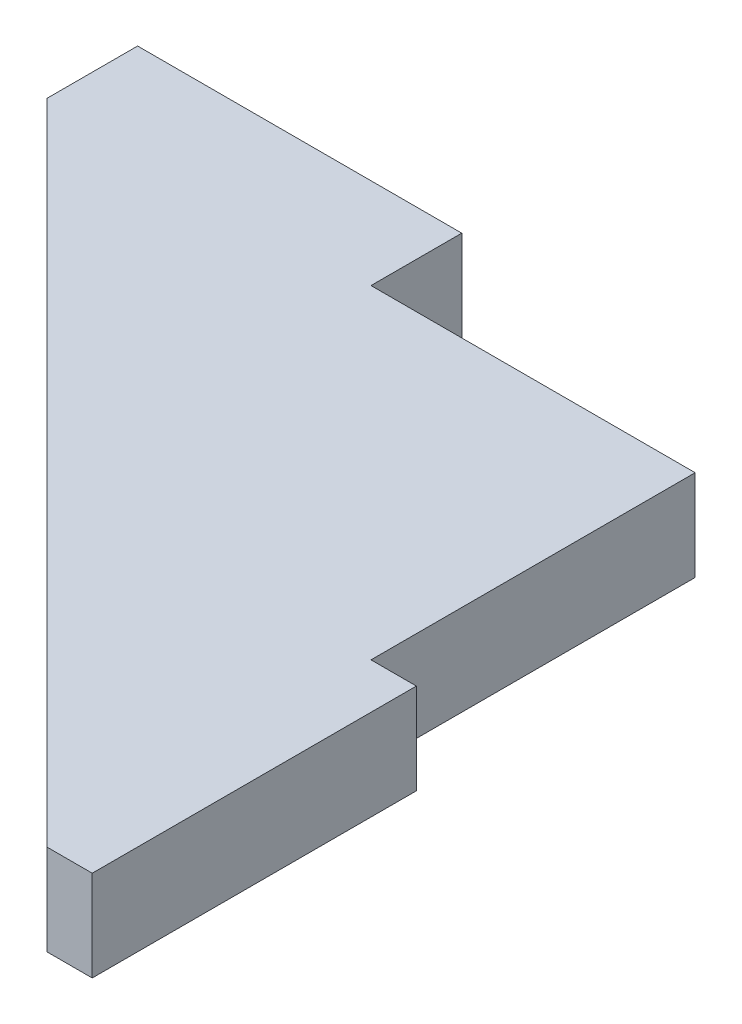
ISO-10303-21;
HEADER;
FILE_DESCRIPTION(('STEP AP214'),'2;1');
FILE_NAME('part.step','',(''),(''),'','','');
FILE_SCHEMA(('AUTOMOTIVE_DESIGN { 1 0 10303 214 1 1 1 1 }'));
ENDSEC;
DATA;
#1=APPLICATION_CONTEXT('core data for automotive mechanical design processes');
#2=APPLICATION_PROTOCOL_DEFINITION('international standard','automotive_design',2000,#1);
#3=PRODUCT_CONTEXT('',#1,'mechanical');
#4=PRODUCT('Part','Part','',(#3));
#5=PRODUCT_RELATED_PRODUCT_CATEGORY('part','',(#4));
#6=PRODUCT_DEFINITION_FORMATION('','',#4);
#7=PRODUCT_DEFINITION_CONTEXT('part definition',#1,'design');
#8=PRODUCT_DEFINITION('design','',#6,#7);
#9=PRODUCT_DEFINITION_SHAPE('','',#8);
#10=(LENGTH_UNIT() NAMED_UNIT(*) SI_UNIT(.MILLI.,.METRE.));
#11=(NAMED_UNIT(*) PLANE_ANGLE_UNIT() SI_UNIT($,.RADIAN.));
#12=(NAMED_UNIT(*) SI_UNIT($,.STERADIAN.) SOLID_ANGLE_UNIT());
#13=UNCERTAINTY_MEASURE_WITH_UNIT(LENGTH_MEASURE(1.E-05),#10,'distance_accuracy_value','');
#14=(GEOMETRIC_REPRESENTATION_CONTEXT(3) GLOBAL_UNCERTAINTY_ASSIGNED_CONTEXT((#13)) GLOBAL_UNIT_ASSIGNED_CONTEXT((#10,
#11,#12)) REPRESENTATION_CONTEXT('',''));
#15=CARTESIAN_POINT('',(0.,0.,0.));
#16=DIRECTION('',(0.,0.,1.));
#17=DIRECTION('',(1.,0.,0.));
#18=AXIS2_PLACEMENT_3D('',#15,#16,#17);
#19=CARTESIAN_POINT('',(116.6,5.6,25.6));
#20=DIRECTION('',(1.,0.,0.));
#21=DIRECTION('',(0.,0.,-1.));
#22=AXIS2_PLACEMENT_3D('',#19,#20,#21);
#23=PLANE('',#22);
#24=DIRECTION('',(0.,0.,1.));
#25=VECTOR('',#24,1.);
#26=CARTESIAN_POINT('',(116.6,0.,25.6));
#27=LINE('',#26,#25);
#28=CARTESIAN_POINT('',(116.6,0.,5.59999999999998));
#29=VERTEX_POINT('',#28);
#30=CARTESIAN_POINT('',(116.6,0.,25.6));
#31=VERTEX_POINT('',#30);
#32=EDGE_CURVE('E135',#29,#31,#27,.T.);
#33=ORIENTED_EDGE('',*,*,#32,.F.);
#34=DIRECTION('',(0.,-1.,0.));
#35=VECTOR('',#34,1.);
#36=CARTESIAN_POINT('',(116.6,5.6,5.59999999999998));
#37=LINE('',#36,#35);
#38=CARTESIAN_POINT('',(116.6,5.6,5.59999999999998));
#39=VERTEX_POINT('',#38);
#40=EDGE_CURVE('E11',#39,#29,#37,.T.);
#41=ORIENTED_EDGE('',*,*,#40,.F.);
#42=DIRECTION('',(0.,0.,1.));
#43=VECTOR('',#42,1.);
#44=CARTESIAN_POINT('',(116.6,5.6,25.6));
#45=LINE('',#44,#43);
#46=CARTESIAN_POINT('',(116.6,5.6,25.6));
#47=VERTEX_POINT('',#46);
#48=EDGE_CURVE('E158',#39,#47,#45,.T.);
#49=ORIENTED_EDGE('',*,*,#48,.T.);
#50=DIRECTION('',(0.,-1.,0.));
#51=VECTOR('',#50,1.);
#52=CARTESIAN_POINT('',(116.6,5.6,25.6));
#53=LINE('',#52,#51);
#54=EDGE_CURVE('E35',#47,#31,#53,.T.);
#55=ORIENTED_EDGE('',*,*,#54,.T.);
#56=EDGE_LOOP('',(#33,#41,#49,#55));
#57=FACE_BOUND('',#56,.T.);
#58=ADVANCED_FACE('F32',(#57),#23,.T.);
#59=CARTESIAN_POINT('',(116.6,5.6,5.59999999999998));
#60=DIRECTION('',(0.,0.,-1.));
#61=DIRECTION('',(-1.,0.,0.));
#62=AXIS2_PLACEMENT_3D('',#59,#60,#61);
#63=PLANE('',#62);
#64=DIRECTION('',(1.,0.,0.));
#65=VECTOR('',#64,1.);
#66=CARTESIAN_POINT('',(116.6,0.,5.59999999999998));
#67=LINE('',#66,#65);
#68=CARTESIAN_POINT('',(96.6000000000001,0.,5.6));
#69=VERTEX_POINT('',#68);
#70=EDGE_CURVE('E156',#69,#29,#67,.T.);
#71=ORIENTED_EDGE('',*,*,#70,.F.);
#72=DIRECTION('',(0.,-1.,0.));
#73=VECTOR('',#72,1.);
#74=CARTESIAN_POINT('',(96.6000000000001,5.6,5.6));
#75=LINE('',#74,#73);
#76=CARTESIAN_POINT('',(96.6000000000001,5.6,5.6));
#77=VERTEX_POINT('',#76);
#78=EDGE_CURVE('E41',#77,#69,#75,.T.);
#79=ORIENTED_EDGE('',*,*,#78,.F.);
#80=DIRECTION('',(1.,0.,0.));
#81=VECTOR('',#80,1.);
#82=CARTESIAN_POINT('',(116.6,5.6,5.59999999999998));
#83=LINE('',#82,#81);
#84=EDGE_CURVE('E125',#77,#39,#83,.T.);
#85=ORIENTED_EDGE('',*,*,#84,.T.);
#86=ORIENTED_EDGE('',*,*,#40,.T.);
#87=EDGE_LOOP('',(#71,#79,#85,#86));
#88=FACE_BOUND('',#87,.T.);
#89=ADVANCED_FACE('F172',(#88),#63,.T.);
#90=CARTESIAN_POINT('',(96.6000000000001,5.6,5.6));
#91=DIRECTION('',(1.,0.,0.));
#92=DIRECTION('',(0.,0.,-1.));
#93=AXIS2_PLACEMENT_3D('',#90,#91,#92);
#94=PLANE('',#93);
#95=DIRECTION('',(0.,0.,1.));
#96=VECTOR('',#95,1.);
#97=CARTESIAN_POINT('',(96.6000000000001,0.,5.6));
#98=LINE('',#97,#96);
#99=CARTESIAN_POINT('',(96.6000000000001,0.,0.));
#100=VERTEX_POINT('',#99);
#101=EDGE_CURVE('E112',#100,#69,#98,.T.);
#102=ORIENTED_EDGE('',*,*,#101,.F.);
#103=DIRECTION('',(0.,-1.,0.));
#104=VECTOR('',#103,1.);
#105=CARTESIAN_POINT('',(96.6000000000001,5.6,0.));
#106=LINE('',#105,#104);
#107=CARTESIAN_POINT('',(96.6000000000001,5.6,0.));
#108=VERTEX_POINT('',#107);
#109=EDGE_CURVE('E107',#108,#100,#106,.T.);
#110=ORIENTED_EDGE('',*,*,#109,.F.);
#111=DIRECTION('',(0.,0.,1.));
#112=VECTOR('',#111,1.);
#113=CARTESIAN_POINT('',(96.6000000000001,5.6,5.6));
#114=LINE('',#113,#112);
#115=EDGE_CURVE('E110',#108,#77,#114,.T.);
#116=ORIENTED_EDGE('',*,*,#115,.T.);
#117=ORIENTED_EDGE('',*,*,#78,.T.);
#118=EDGE_LOOP('',(#102,#110,#116,#117));
#119=FACE_BOUND('',#118,.T.);
#120=ADVANCED_FACE('F109',(#119),#94,.T.);
#121=CARTESIAN_POINT('',(96.6000000000001,5.6,0.));
#122=DIRECTION('',(0.,0.,-1.));
#123=DIRECTION('',(-1.,0.,0.));
#124=AXIS2_PLACEMENT_3D('',#121,#122,#123);
#125=PLANE('',#124);
#126=DIRECTION('',(1.,0.,0.));
#127=VECTOR('',#126,1.);
#128=CARTESIAN_POINT('',(96.6000000000001,0.,0.));
#129=LINE('',#128,#127);
#130=CARTESIAN_POINT('',(76.6000000000001,0.,0.));
#131=VERTEX_POINT('',#130);
#132=EDGE_CURVE('E153',#131,#100,#129,.T.);
#133=ORIENTED_EDGE('',*,*,#132,.F.);
#134=DIRECTION('',(0.,-1.,0.));
#135=VECTOR('',#134,1.);
#136=CARTESIAN_POINT('',(76.6000000000001,5.6,0.));
#137=LINE('',#136,#135);
#138=CARTESIAN_POINT('',(76.6000000000001,5.6,0.));
#139=VERTEX_POINT('',#138);
#140=EDGE_CURVE('E117',#139,#131,#137,.T.);
#141=ORIENTED_EDGE('',*,*,#140,.F.);
#142=DIRECTION('',(1.,0.,0.));
#143=VECTOR('',#142,1.);
#144=CARTESIAN_POINT('',(96.6000000000001,5.6,0.));
#145=LINE('',#144,#143);
#146=EDGE_CURVE('E123',#139,#108,#145,.T.);
#147=ORIENTED_EDGE('',*,*,#146,.T.);
#148=ORIENTED_EDGE('',*,*,#109,.T.);
#149=EDGE_LOOP('',(#133,#141,#147,#148));
#150=FACE_BOUND('',#149,.T.);
#151=ADVANCED_FACE('F127',(#150),#125,.T.);
#152=CARTESIAN_POINT('',(76.6000000000001,5.6,0.));
#153=DIRECTION('',(-1.,0.,0.));
#154=DIRECTION('',(0.,0.,1.));
#155=AXIS2_PLACEMENT_3D('',#152,#153,#154);
#156=PLANE('',#155);
#157=DIRECTION('',(0.,0.,-1.));
#158=VECTOR('',#157,1.);
#159=CARTESIAN_POINT('',(76.6000000000001,0.,0.));
#160=LINE('',#159,#158);
#161=CARTESIAN_POINT('',(76.6000000000001,0.,5.6));
#162=VERTEX_POINT('',#161);
#163=EDGE_CURVE('E150',#162,#131,#160,.T.);
#164=ORIENTED_EDGE('',*,*,#163,.F.);
#165=DIRECTION('',(0.,-1.,0.));
#166=VECTOR('',#165,1.);
#167=CARTESIAN_POINT('',(76.6000000000001,5.6,5.6));
#168=LINE('',#167,#166);
#169=CARTESIAN_POINT('',(76.6000000000001,5.6,5.6));
#170=VERTEX_POINT('',#169);
#171=EDGE_CURVE('E162',#170,#162,#168,.T.);
#172=ORIENTED_EDGE('',*,*,#171,.F.);
#173=DIRECTION('',(0.,0.,-1.));
#174=VECTOR('',#173,1.);
#175=CARTESIAN_POINT('',(76.6000000000001,5.6,0.));
#176=LINE('',#175,#174);
#177=EDGE_CURVE('E128',#170,#139,#176,.T.);
#178=ORIENTED_EDGE('',*,*,#177,.T.);
#179=ORIENTED_EDGE('',*,*,#140,.T.);
#180=EDGE_LOOP('',(#164,#172,#178,#179));
#181=FACE_BOUND('',#180,.T.);
#182=ADVANCED_FACE('F185',(#181),#156,.T.);
#183=CARTESIAN_POINT('',(76.6000000000001,5.6,5.6));
#184=DIRECTION('',(-0.707106781186548,0.,0.707106781186548));
#185=DIRECTION('',(0.707106781186548,0.,0.707106781186548));
#186=AXIS2_PLACEMENT_3D('',#183,#184,#185);
#187=PLANE('',#186);
#188=DIRECTION('',(-0.707106781186547,0.,-0.707106781186547));
#189=VECTOR('',#188,1.);
#190=CARTESIAN_POINT('',(76.6000000000001,0.,5.6));
#191=LINE('',#190,#189);
#192=CARTESIAN_POINT('',(116.6,0.,45.6));
#193=VERTEX_POINT('',#192);
#194=EDGE_CURVE('E147',#193,#162,#191,.T.);
#195=ORIENTED_EDGE('',*,*,#194,.F.);
#196=DIRECTION('',(0.,-1.,0.));
#197=VECTOR('',#196,1.);
#198=CARTESIAN_POINT('',(116.6,5.6,45.6));
#199=LINE('',#198,#197);
#200=CARTESIAN_POINT('',(116.6,5.6,45.6));
#201=VERTEX_POINT('',#200);
#202=EDGE_CURVE('E164',#201,#193,#199,.T.);
#203=ORIENTED_EDGE('',*,*,#202,.F.);
#204=DIRECTION('',(-0.707106781186547,0.,-0.707106781186547));
#205=VECTOR('',#204,1.);
#206=CARTESIAN_POINT('',(76.6000000000001,5.6,5.6));
#207=LINE('',#206,#205);
#208=EDGE_CURVE('E130',#201,#170,#207,.T.);
#209=ORIENTED_EDGE('',*,*,#208,.T.);
#210=ORIENTED_EDGE('',*,*,#171,.T.);
#211=EDGE_LOOP('',(#195,#203,#209,#210));
#212=FACE_BOUND('',#211,.T.);
#213=ADVANCED_FACE('F188',(#212),#187,.T.);
#214=CARTESIAN_POINT('',(119.4,5.6,45.6));
#215=DIRECTION('',(0.,0.,1.));
#216=DIRECTION('',(1.,0.,0.));
#217=AXIS2_PLACEMENT_3D('',#214,#215,#216);
#218=PLANE('',#217);
#219=DIRECTION('',(-1.,0.,0.));
#220=VECTOR('',#219,1.);
#221=CARTESIAN_POINT('',(119.4,0.,45.6));
#222=LINE('',#221,#220);
#223=CARTESIAN_POINT('',(119.4,0.,45.6));
#224=VERTEX_POINT('',#223);
#225=EDGE_CURVE('E144',#224,#193,#222,.T.);
#226=ORIENTED_EDGE('',*,*,#225,.F.);
#227=DIRECTION('',(0.,-1.,0.));
#228=VECTOR('',#227,1.);
#229=CARTESIAN_POINT('',(119.4,5.6,45.6));
#230=LINE('',#229,#228);
#231=CARTESIAN_POINT('',(119.4,5.6,45.6));
#232=VERTEX_POINT('',#231);
#233=EDGE_CURVE('E166',#232,#224,#230,.T.);
#234=ORIENTED_EDGE('',*,*,#233,.F.);
#235=DIRECTION('',(-1.,0.,0.));
#236=VECTOR('',#235,1.);
#237=CARTESIAN_POINT('',(119.4,5.6,45.6));
#238=LINE('',#237,#236);
#239=EDGE_CURVE('E273',#232,#201,#238,.T.);
#240=ORIENTED_EDGE('',*,*,#239,.T.);
#241=ORIENTED_EDGE('',*,*,#202,.T.);
#242=EDGE_LOOP('',(#226,#234,#240,#241));
#243=FACE_BOUND('',#242,.T.);
#244=ADVANCED_FACE('F192',(#243),#218,.T.);
#245=CARTESIAN_POINT('',(119.4,5.6,25.6));
#246=DIRECTION('',(1.,0.,0.));
#247=DIRECTION('',(0.,0.,-1.));
#248=AXIS2_PLACEMENT_3D('',#245,#246,#247);
#249=PLANE('',#248);
#250=DIRECTION('',(0.,0.,1.));
#251=VECTOR('',#250,1.);
#252=CARTESIAN_POINT('',(119.4,0.,25.6));
#253=LINE('',#252,#251);
#254=CARTESIAN_POINT('',(119.4,0.,25.6));
#255=VERTEX_POINT('',#254);
#256=EDGE_CURVE('E141',#255,#224,#253,.T.);
#257=ORIENTED_EDGE('',*,*,#256,.F.);
#258=DIRECTION('',(0.,-1.,0.));
#259=VECTOR('',#258,1.);
#260=CARTESIAN_POINT('',(119.4,5.6,25.6));
#261=LINE('',#260,#259);
#262=CARTESIAN_POINT('',(119.4,5.6,25.6));
#263=VERTEX_POINT('',#262);
#264=EDGE_CURVE('E167',#263,#255,#261,.T.);
#265=ORIENTED_EDGE('',*,*,#264,.F.);
#266=DIRECTION('',(0.,0.,1.));
#267=VECTOR('',#266,1.);
#268=CARTESIAN_POINT('',(119.4,5.6,25.6));
#269=LINE('',#268,#267);
#270=EDGE_CURVE('E277',#263,#232,#269,.T.);
#271=ORIENTED_EDGE('',*,*,#270,.T.);
#272=ORIENTED_EDGE('',*,*,#233,.T.);
#273=EDGE_LOOP('',(#257,#265,#271,#272));
#274=FACE_BOUND('',#273,.T.);
#275=ADVANCED_FACE('F196',(#274),#249,.T.);
#276=CARTESIAN_POINT('',(119.4,5.6,25.6));
#277=DIRECTION('',(0.,0.,-1.));
#278=DIRECTION('',(-1.,0.,0.));
#279=AXIS2_PLACEMENT_3D('',#276,#277,#278);
#280=PLANE('',#279);
#281=DIRECTION('',(1.,0.,0.));
#282=VECTOR('',#281,1.);
#283=CARTESIAN_POINT('',(119.4,0.,25.6));
#284=LINE('',#283,#282);
#285=EDGE_CURVE('E138',#31,#255,#284,.T.);
#286=ORIENTED_EDGE('',*,*,#285,.F.);
#287=ORIENTED_EDGE('',*,*,#54,.F.);
#288=DIRECTION('',(1.,0.,0.));
#289=VECTOR('',#288,1.);
#290=CARTESIAN_POINT('',(119.4,5.6,25.6));
#291=LINE('',#290,#289);
#292=EDGE_CURVE('E281',#47,#263,#291,.T.);
#293=ORIENTED_EDGE('',*,*,#292,.T.);
#294=ORIENTED_EDGE('',*,*,#264,.T.);
#295=EDGE_LOOP('',(#286,#287,#293,#294));
#296=FACE_BOUND('',#295,.T.);
#297=ADVANCED_FACE('F169',(#296),#280,.T.);
#298=CARTESIAN_POINT('',(0.,5.6,0.));
#299=DIRECTION('',(0.,1.,0.));
#300=DIRECTION('',(0.,0.,1.));
#301=AXIS2_PLACEMENT_3D('',#298,#299,#300);
#302=PLANE('',#301);
#303=ORIENTED_EDGE('',*,*,#48,.F.);
#304=ORIENTED_EDGE('',*,*,#84,.F.);
#305=ORIENTED_EDGE('',*,*,#115,.F.);
#306=ORIENTED_EDGE('',*,*,#146,.F.);
#307=ORIENTED_EDGE('',*,*,#177,.F.);
#308=ORIENTED_EDGE('',*,*,#208,.F.);
#309=ORIENTED_EDGE('',*,*,#239,.F.);
#310=ORIENTED_EDGE('',*,*,#270,.F.);
#311=ORIENTED_EDGE('',*,*,#292,.F.);
#312=EDGE_LOOP('',(#303,#304,#305,#306,#307,#308,#309,#310,#311));
#313=FACE_BOUND('',#312,.T.);
#314=ADVANCED_FACE('F121',(#313),#302,.T.);
#315=CARTESIAN_POINT('',(0.,0.,0.));
#316=DIRECTION('',(0.,1.,0.));
#317=DIRECTION('',(0.,0.,1.));
#318=AXIS2_PLACEMENT_3D('',#315,#316,#317);
#319=PLANE('',#318);
#320=ORIENTED_EDGE('',*,*,#32,.T.);
#321=ORIENTED_EDGE('',*,*,#285,.T.);
#322=ORIENTED_EDGE('',*,*,#256,.T.);
#323=ORIENTED_EDGE('',*,*,#225,.T.);
#324=ORIENTED_EDGE('',*,*,#194,.T.);
#325=ORIENTED_EDGE('',*,*,#163,.T.);
#326=ORIENTED_EDGE('',*,*,#132,.T.);
#327=ORIENTED_EDGE('',*,*,#101,.T.);
#328=ORIENTED_EDGE('',*,*,#70,.T.);
#329=EDGE_LOOP('',(#320,#321,#322,#323,#324,#325,#326,#327,#328));
#330=FACE_BOUND('',#329,.T.);
#331=ADVANCED_FACE('F171',(#330),#319,.F.);
#332=CLOSED_SHELL('',(#58,#89,#120,#151,#182,#213,#244,#275,#297,#314,#331));
#333=MANIFOLD_SOLID_BREP('B2',#332);
#334=ADVANCED_BREP_SHAPE_REPRESENTATION('',(#18,#333),#14);
#335=SHAPE_DEFINITION_REPRESENTATION(#9,#334);
ENDSEC;
END-ISO-10303-21;
